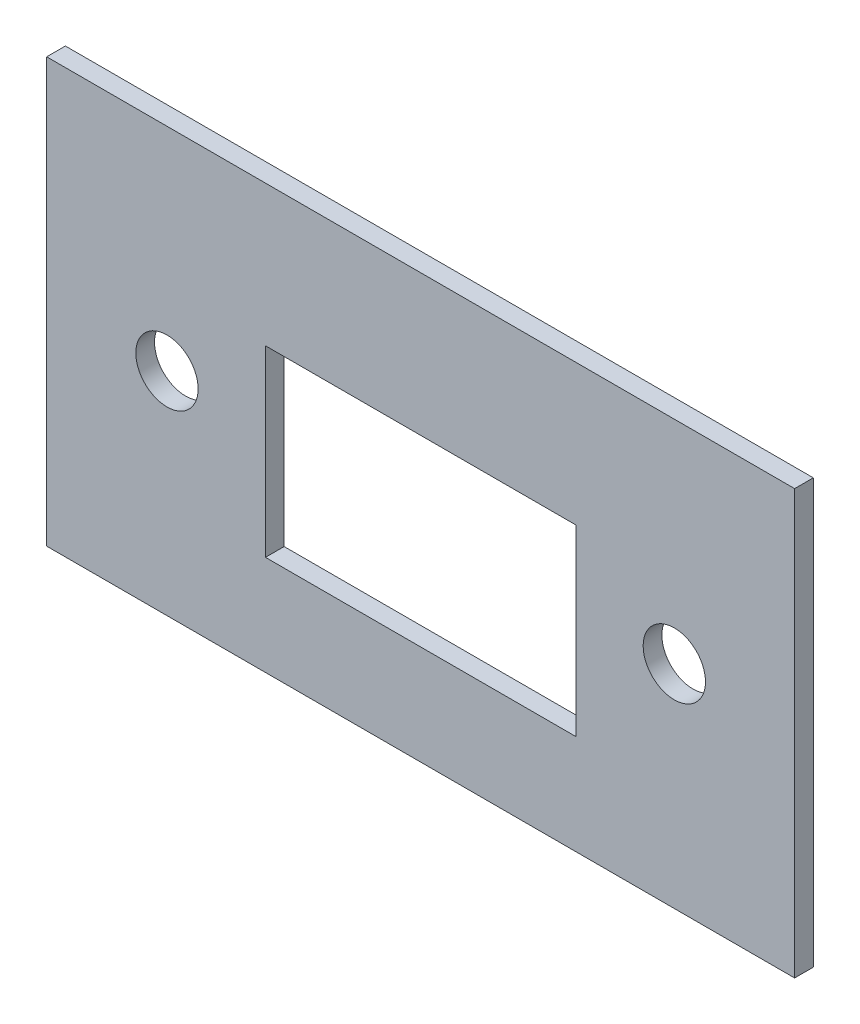
ISO-10303-21;
HEADER;
FILE_DESCRIPTION(('STEP AP214'),'2;1');
FILE_NAME('part.step','',(''),(''),'','','');
FILE_SCHEMA(('AUTOMOTIVE_DESIGN { 1 0 10303 214 1 1 1 1 }'));
ENDSEC;
DATA;
#1=APPLICATION_CONTEXT('core data for automotive mechanical design processes');
#2=APPLICATION_PROTOCOL_DEFINITION('international standard','automotive_design',2000,#1);
#3=PRODUCT_CONTEXT('',#1,'mechanical');
#4=PRODUCT('Part','Part','',(#3));
#5=PRODUCT_RELATED_PRODUCT_CATEGORY('part','',(#4));
#6=PRODUCT_DEFINITION_FORMATION('','',#4);
#7=PRODUCT_DEFINITION_CONTEXT('part definition',#1,'design');
#8=PRODUCT_DEFINITION('design','',#6,#7);
#9=PRODUCT_DEFINITION_SHAPE('','',#8);
#10=(LENGTH_UNIT() NAMED_UNIT(*) SI_UNIT(.MILLI.,.METRE.));
#11=(NAMED_UNIT(*) PLANE_ANGLE_UNIT() SI_UNIT($,.RADIAN.));
#12=(NAMED_UNIT(*) SI_UNIT($,.STERADIAN.) SOLID_ANGLE_UNIT());
#13=UNCERTAINTY_MEASURE_WITH_UNIT(LENGTH_MEASURE(1.E-05),#10,'distance_accuracy_value','');
#14=(GEOMETRIC_REPRESENTATION_CONTEXT(3) GLOBAL_UNCERTAINTY_ASSIGNED_CONTEXT((#13)) GLOBAL_UNIT_ASSIGNED_CONTEXT((#10,
#11,#12)) REPRESENTATION_CONTEXT('',''));
#15=CARTESIAN_POINT('',(0.,0.,0.));
#16=DIRECTION('',(0.,0.,1.));
#17=DIRECTION('',(1.,0.,0.));
#18=AXIS2_PLACEMENT_3D('',#15,#16,#17);
#19=CARTESIAN_POINT('',(0.,0.,0.));
#20=DIRECTION('',(0.,0.,1.));
#21=DIRECTION('',(1.,0.,0.));
#22=AXIS2_PLACEMENT_3D('',#19,#20,#21);
#23=PLANE('',#22);
#24=CARTESIAN_POINT('',(-20.3499999999777,14.9,0.));
#25=DIRECTION('',(0.,0.,-1.));
#26=DIRECTION('',(-1.,0.,0.));
#27=AXIS2_PLACEMENT_3D('',#24,#25,#26);
#28=CIRCLE('',#27,2.5);
#29=CARTESIAN_POINT('',(-22.8499999999777,14.9,0.));
#30=VERTEX_POINT('',#29);
#31=EDGE_CURVE('E370',#30,#30,#28,.T.);
#32=ORIENTED_EDGE('',*,*,#31,.F.);
#33=EDGE_LOOP('',(#32));
#34=FACE_BOUND('',#33,.T.);
#35=CARTESIAN_POINT('',(20.3500000000222,14.8999999999999,0.));
#36=DIRECTION('',(0.,0.,-1.));
#37=DIRECTION('',(-1.,0.,0.));
#38=AXIS2_PLACEMENT_3D('',#35,#36,#37);
#39=CIRCLE('',#38,2.5);
#40=CARTESIAN_POINT('',(17.8500000000222,14.8999999999999,0.));
#41=VERTEX_POINT('',#40);
#42=EDGE_CURVE('E374',#41,#41,#39,.T.);
#43=ORIENTED_EDGE('',*,*,#42,.F.);
#44=EDGE_LOOP('',(#43));
#45=FACE_BOUND('',#44,.T.);
#46=DIRECTION('',(0.,1.,0.));
#47=VECTOR('',#46,1.);
#48=CARTESIAN_POINT('',(26.4,1.5,0.));
#49=LINE('',#48,#47);
#50=CARTESIAN_POINT('',(26.4,1.5,0.));
#51=VERTEX_POINT('',#50);
#52=CARTESIAN_POINT('',(26.4,28.3,0.));
#53=VERTEX_POINT('',#52);
#54=EDGE_CURVE('E213',#51,#53,#49,.T.);
#55=ORIENTED_EDGE('',*,*,#54,.F.);
#56=DIRECTION('',(1.,0.,0.));
#57=VECTOR('',#56,1.);
#58=CARTESIAN_POINT('',(-26.4,1.5,0.));
#59=LINE('',#58,#57);
#60=CARTESIAN_POINT('',(-26.4,1.5,0.));
#61=VERTEX_POINT('',#60);
#62=EDGE_CURVE('E218',#61,#51,#59,.T.);
#63=ORIENTED_EDGE('',*,*,#62,.F.);
#64=DIRECTION('',(0.,-1.,0.));
#65=VECTOR('',#64,1.);
#66=CARTESIAN_POINT('',(-26.4,28.3,0.));
#67=LINE('',#66,#65);
#68=CARTESIAN_POINT('',(-26.4,28.3,0.));
#69=VERTEX_POINT('',#68);
#70=EDGE_CURVE('E233',#69,#61,#67,.T.);
#71=ORIENTED_EDGE('',*,*,#70,.F.);
#72=DIRECTION('',(-1.,0.,0.));
#73=VECTOR('',#72,1.);
#74=CARTESIAN_POINT('',(26.4,28.3,0.));
#75=LINE('',#74,#73);
#76=EDGE_CURVE('E230',#53,#69,#75,.T.);
#77=ORIENTED_EDGE('',*,*,#76,.F.);
#78=EDGE_LOOP('',(#55,#63,#71,#77));
#79=FACE_BOUND('',#78,.T.);
#80=DIRECTION('',(0.,-1.,0.));
#81=VECTOR('',#80,1.);
#82=CARTESIAN_POINT('',(12.45,5.9,0.));
#83=LINE('',#82,#81);
#84=CARTESIAN_POINT('',(12.45,20.5999999999998,0.));
#85=VERTEX_POINT('',#84);
#86=CARTESIAN_POINT('',(12.45,5.9,0.));
#87=VERTEX_POINT('',#86);
#88=EDGE_CURVE('E183',#85,#87,#83,.T.);
#89=ORIENTED_EDGE('',*,*,#88,.F.);
#90=DIRECTION('',(1.,0.,0.));
#91=VECTOR('',#90,1.);
#92=CARTESIAN_POINT('',(12.45,20.5999999999998,0.));
#93=LINE('',#92,#91);
#94=CARTESIAN_POINT('',(-12.45,20.5999999999998,0.));
#95=VERTEX_POINT('',#94);
#96=EDGE_CURVE('E180',#95,#85,#93,.T.);
#97=ORIENTED_EDGE('',*,*,#96,.F.);
#98=DIRECTION('',(0.,1.,0.));
#99=VECTOR('',#98,1.);
#100=CARTESIAN_POINT('',(-12.45,20.5999999999998,0.));
#101=LINE('',#100,#99);
#102=CARTESIAN_POINT('',(-12.45,5.9,0.));
#103=VERTEX_POINT('',#102);
#104=EDGE_CURVE('E158',#103,#95,#101,.T.);
#105=ORIENTED_EDGE('',*,*,#104,.F.);
#106=DIRECTION('',(-1.,0.,0.));
#107=VECTOR('',#106,1.);
#108=CARTESIAN_POINT('',(-12.45,5.9,0.));
#109=LINE('',#108,#107);
#110=EDGE_CURVE('E383',#87,#103,#109,.T.);
#111=ORIENTED_EDGE('',*,*,#110,.F.);
#112=EDGE_LOOP('',(#89,#97,#105,#111));
#113=FACE_BOUND('',#112,.T.);
#114=ADVANCED_FACE('F37',(#34,#45,#79,#113),#23,.F.);
#115=CARTESIAN_POINT('',(27.9,29.8,-2.));
#116=DIRECTION('',(0.,1.,0.));
#117=DIRECTION('',(0.,0.,1.));
#118=AXIS2_PLACEMENT_3D('',#115,#116,#117);
#119=PLANE('',#118);
#120=DIRECTION('',(-1.,0.,0.));
#121=VECTOR('',#120,1.);
#122=CARTESIAN_POINT('',(27.9,29.8,0.));
#123=LINE('',#122,#121);
#124=CARTESIAN_POINT('',(27.9,29.8,0.));
#125=VERTEX_POINT('',#124);
#126=CARTESIAN_POINT('',(-27.9,29.8,0.));
#127=VERTEX_POINT('',#126);
#128=EDGE_CURVE('E241',#125,#127,#123,.T.);
#129=ORIENTED_EDGE('',*,*,#128,.F.);
#130=DIRECTION('',(0.,0.,1.));
#131=VECTOR('',#130,1.);
#132=CARTESIAN_POINT('',(27.9,29.8,-2.));
#133=LINE('',#132,#131);
#134=CARTESIAN_POINT('',(27.9,29.8,-2.));
#135=VERTEX_POINT('',#134);
#136=EDGE_CURVE('E11',#135,#125,#133,.T.);
#137=ORIENTED_EDGE('',*,*,#136,.F.);
#138=DIRECTION('',(-1.,0.,0.));
#139=VECTOR('',#138,1.);
#140=CARTESIAN_POINT('',(27.9,29.8,-2.));
#141=LINE('',#140,#139);
#142=CARTESIAN_POINT('',(-27.9,29.8,-2.));
#143=VERTEX_POINT('',#142);
#144=EDGE_CURVE('E250',#135,#143,#141,.T.);
#145=ORIENTED_EDGE('',*,*,#144,.T.);
#146=DIRECTION('',(0.,0.,1.));
#147=VECTOR('',#146,1.);
#148=CARTESIAN_POINT('',(-27.9,29.8,-2.));
#149=LINE('',#148,#147);
#150=EDGE_CURVE('E41',#143,#127,#149,.T.);
#151=ORIENTED_EDGE('',*,*,#150,.T.);
#152=EDGE_LOOP('',(#129,#137,#145,#151));
#153=FACE_BOUND('',#152,.T.);
#154=ADVANCED_FACE('F39',(#153),#119,.T.);
#155=CARTESIAN_POINT('',(27.9000000000001,0.,-2.));
#156=DIRECTION('',(1.,0.,0.));
#157=DIRECTION('',(0.,1.,0.));
#158=AXIS2_PLACEMENT_3D('',#155,#156,#157);
#159=PLANE('',#158);
#160=DIRECTION('',(0.,1.,0.));
#161=VECTOR('',#160,1.);
#162=CARTESIAN_POINT('',(27.9000000000001,0.,0.));
#163=LINE('',#162,#161);
#164=CARTESIAN_POINT('',(27.9000000000001,0.,0.));
#165=VERTEX_POINT('',#164);
#166=EDGE_CURVE('E254',#165,#125,#163,.T.);
#167=ORIENTED_EDGE('',*,*,#166,.F.);
#168=DIRECTION('',(0.,0.,1.));
#169=VECTOR('',#168,1.);
#170=CARTESIAN_POINT('',(27.9000000000001,0.,-2.));
#171=LINE('',#170,#169);
#172=CARTESIAN_POINT('',(27.9000000000001,0.,-2.));
#173=VERTEX_POINT('',#172);
#174=EDGE_CURVE('E46',#173,#165,#171,.T.);
#175=ORIENTED_EDGE('',*,*,#174,.F.);
#176=DIRECTION('',(0.,1.,0.));
#177=VECTOR('',#176,1.);
#178=CARTESIAN_POINT('',(27.9000000000001,0.,-2.));
#179=LINE('',#178,#177);
#180=EDGE_CURVE('E260',#173,#135,#179,.T.);
#181=ORIENTED_EDGE('',*,*,#180,.T.);
#182=ORIENTED_EDGE('',*,*,#136,.T.);
#183=EDGE_LOOP('',(#167,#175,#181,#182));
#184=FACE_BOUND('',#183,.T.);
#185=ADVANCED_FACE('F285',(#184),#159,.T.);
#186=CARTESIAN_POINT('',(-27.9,0.,-2.));
#187=DIRECTION('',(0.,-1.,0.));
#188=DIRECTION('',(0.,0.,-1.));
#189=AXIS2_PLACEMENT_3D('',#186,#187,#188);
#190=PLANE('',#189);
#191=DIRECTION('',(1.,0.,0.));
#192=VECTOR('',#191,1.);
#193=CARTESIAN_POINT('',(-27.9,0.,0.));
#194=LINE('',#193,#192);
#195=CARTESIAN_POINT('',(-27.9,0.,0.));
#196=VERTEX_POINT('',#195);
#197=EDGE_CURVE('E268',#196,#165,#194,.T.);
#198=ORIENTED_EDGE('',*,*,#197,.F.);
#199=DIRECTION('',(0.,0.,1.));
#200=VECTOR('',#199,1.);
#201=CARTESIAN_POINT('',(-27.9,0.,-2.));
#202=LINE('',#201,#200);
#203=CARTESIAN_POINT('',(-27.9,0.,-2.));
#204=VERTEX_POINT('',#203);
#205=EDGE_CURVE('E273',#204,#196,#202,.T.);
#206=ORIENTED_EDGE('',*,*,#205,.F.);
#207=DIRECTION('',(1.,0.,0.));
#208=VECTOR('',#207,1.);
#209=CARTESIAN_POINT('',(-27.9,0.,-2.));
#210=LINE('',#209,#208);
#211=EDGE_CURVE('E257',#204,#173,#210,.T.);
#212=ORIENTED_EDGE('',*,*,#211,.T.);
#213=ORIENTED_EDGE('',*,*,#174,.T.);
#214=EDGE_LOOP('',(#198,#206,#212,#213));
#215=FACE_BOUND('',#214,.T.);
#216=ADVANCED_FACE('F291',(#215),#190,.T.);
#217=CARTESIAN_POINT('',(-27.9,29.8,-2.));
#218=DIRECTION('',(-1.,0.,0.));
#219=DIRECTION('',(0.,0.,1.));
#220=AXIS2_PLACEMENT_3D('',#217,#218,#219);
#221=PLANE('',#220);
#222=DIRECTION('',(0.,-1.,0.));
#223=VECTOR('',#222,1.);
#224=CARTESIAN_POINT('',(-27.9,29.8,0.));
#225=LINE('',#224,#223);
#226=EDGE_CURVE('E265',#127,#196,#225,.T.);
#227=ORIENTED_EDGE('',*,*,#226,.F.);
#228=ORIENTED_EDGE('',*,*,#150,.F.);
#229=DIRECTION('',(0.,-1.,0.));
#230=VECTOR('',#229,1.);
#231=CARTESIAN_POINT('',(-27.9,29.8,-2.));
#232=LINE('',#231,#230);
#233=EDGE_CURVE('E253',#143,#204,#232,.T.);
#234=ORIENTED_EDGE('',*,*,#233,.T.);
#235=ORIENTED_EDGE('',*,*,#205,.T.);
#236=EDGE_LOOP('',(#227,#228,#234,#235));
#237=FACE_BOUND('',#236,.T.);
#238=ADVANCED_FACE('F280',(#237),#221,.T.);
#239=CARTESIAN_POINT('',(0.,0.,-2.));
#240=DIRECTION('',(0.,0.,1.));
#241=DIRECTION('',(1.,0.,0.));
#242=AXIS2_PLACEMENT_3D('',#239,#240,#241);
#243=PLANE('',#242);
#244=DIRECTION('',(1.,0.,0.));
#245=VECTOR('',#244,1.);
#246=CARTESIAN_POINT('',(-26.4,1.5,-2.));
#247=LINE('',#246,#245);
#248=CARTESIAN_POINT('',(-26.4,1.5,-2.));
#249=VERTEX_POINT('',#248);
#250=CARTESIAN_POINT('',(26.4,1.5,-2.));
#251=VERTEX_POINT('',#250);
#252=EDGE_CURVE('E224',#249,#251,#247,.T.);
#253=ORIENTED_EDGE('',*,*,#252,.T.);
#254=DIRECTION('',(0.,1.,0.));
#255=VECTOR('',#254,1.);
#256=CARTESIAN_POINT('',(26.4,1.5,-2.));
#257=LINE('',#256,#255);
#258=CARTESIAN_POINT('',(26.4,28.3,-2.));
#259=VERTEX_POINT('',#258);
#260=EDGE_CURVE('E214',#251,#259,#257,.T.);
#261=ORIENTED_EDGE('',*,*,#260,.T.);
#262=DIRECTION('',(-1.,0.,0.));
#263=VECTOR('',#262,1.);
#264=CARTESIAN_POINT('',(26.4,28.3,-2.));
#265=LINE('',#264,#263);
#266=CARTESIAN_POINT('',(-26.4,28.3,-2.));
#267=VERTEX_POINT('',#266);
#268=EDGE_CURVE('E217',#259,#267,#265,.T.);
#269=ORIENTED_EDGE('',*,*,#268,.T.);
#270=DIRECTION('',(0.,-1.,0.));
#271=VECTOR('',#270,1.);
#272=CARTESIAN_POINT('',(-26.4,28.3,-2.));
#273=LINE('',#272,#271);
#274=EDGE_CURVE('E221',#267,#249,#273,.T.);
#275=ORIENTED_EDGE('',*,*,#274,.T.);
#276=EDGE_LOOP('',(#253,#261,#269,#275));
#277=FACE_BOUND('',#276,.T.);
#278=ORIENTED_EDGE('',*,*,#144,.F.);
#279=ORIENTED_EDGE('',*,*,#180,.F.);
#280=ORIENTED_EDGE('',*,*,#211,.F.);
#281=ORIENTED_EDGE('',*,*,#233,.F.);
#282=EDGE_LOOP('',(#278,#279,#280,#281));
#283=FACE_BOUND('',#282,.T.);
#284=ADVANCED_FACE('F288',(#277,#283),#243,.F.);
#285=CARTESIAN_POINT('',(26.4,1.5,-2.));
#286=DIRECTION('',(1.,0.,0.));
#287=DIRECTION('',(0.,0.,-1.));
#288=AXIS2_PLACEMENT_3D('',#285,#286,#287);
#289=PLANE('',#288);
#290=ORIENTED_EDGE('',*,*,#54,.T.);
#291=DIRECTION('',(0.,0.,1.));
#292=VECTOR('',#291,1.);
#293=CARTESIAN_POINT('',(26.4,28.3,-2.));
#294=LINE('',#293,#292);
#295=EDGE_CURVE('E227',#259,#53,#294,.T.);
#296=ORIENTED_EDGE('',*,*,#295,.F.);
#297=ORIENTED_EDGE('',*,*,#260,.F.);
#298=DIRECTION('',(0.,0.,1.));
#299=VECTOR('',#298,1.);
#300=CARTESIAN_POINT('',(26.4,1.5,-2.));
#301=LINE('',#300,#299);
#302=EDGE_CURVE('E238',#251,#51,#301,.T.);
#303=ORIENTED_EDGE('',*,*,#302,.T.);
#304=EDGE_LOOP('',(#290,#296,#297,#303));
#305=FACE_BOUND('',#304,.T.);
#306=ADVANCED_FACE('F394',(#305),#289,.F.);
#307=CARTESIAN_POINT('',(-26.4,1.5,-2.));
#308=DIRECTION('',(0.,-1.,0.));
#309=DIRECTION('',(0.,0.,-1.));
#310=AXIS2_PLACEMENT_3D('',#307,#308,#309);
#311=PLANE('',#310);
#312=ORIENTED_EDGE('',*,*,#62,.T.);
#313=ORIENTED_EDGE('',*,*,#302,.F.);
#314=ORIENTED_EDGE('',*,*,#252,.F.);
#315=DIRECTION('',(0.,0.,1.));
#316=VECTOR('',#315,1.);
#317=CARTESIAN_POINT('',(-26.4,1.5,-2.));
#318=LINE('',#317,#316);
#319=EDGE_CURVE('E242',#249,#61,#318,.T.);
#320=ORIENTED_EDGE('',*,*,#319,.T.);
#321=EDGE_LOOP('',(#312,#313,#314,#320));
#322=FACE_BOUND('',#321,.T.);
#323=ADVANCED_FACE('F397',(#322),#311,.F.);
#324=CARTESIAN_POINT('',(-26.4,28.3,-2.));
#325=DIRECTION('',(-1.,0.,0.));
#326=DIRECTION('',(0.,0.,1.));
#327=AXIS2_PLACEMENT_3D('',#324,#325,#326);
#328=PLANE('',#327);
#329=ORIENTED_EDGE('',*,*,#70,.T.);
#330=ORIENTED_EDGE('',*,*,#319,.F.);
#331=ORIENTED_EDGE('',*,*,#274,.F.);
#332=DIRECTION('',(0.,0.,1.));
#333=VECTOR('',#332,1.);
#334=CARTESIAN_POINT('',(-26.4,28.3,-2.));
#335=LINE('',#334,#333);
#336=EDGE_CURVE('E245',#267,#69,#335,.T.);
#337=ORIENTED_EDGE('',*,*,#336,.T.);
#338=EDGE_LOOP('',(#329,#330,#331,#337));
#339=FACE_BOUND('',#338,.T.);
#340=ADVANCED_FACE('F346',(#339),#328,.F.);
#341=CARTESIAN_POINT('',(26.4,28.3,-2.));
#342=DIRECTION('',(0.,1.,0.));
#343=DIRECTION('',(-1.,0.,0.));
#344=AXIS2_PLACEMENT_3D('',#341,#342,#343);
#345=PLANE('',#344);
#346=ORIENTED_EDGE('',*,*,#76,.T.);
#347=ORIENTED_EDGE('',*,*,#336,.F.);
#348=ORIENTED_EDGE('',*,*,#268,.F.);
#349=ORIENTED_EDGE('',*,*,#295,.T.);
#350=EDGE_LOOP('',(#346,#347,#348,#349));
#351=FACE_BOUND('',#350,.T.);
#352=ADVANCED_FACE('F339',(#351),#345,.F.);
#353=CARTESIAN_POINT('',(0.,0.,1.5));
#354=DIRECTION('',(0.,0.,1.));
#355=DIRECTION('',(1.,0.,0.));
#356=AXIS2_PLACEMENT_3D('',#353,#354,#355);
#357=PLANE('',#356);
#358=CARTESIAN_POINT('',(-20.3499999999777,14.9,1.5));
#359=DIRECTION('',(0.,0.,1.));
#360=DIRECTION('',(1.,0.,0.));
#361=AXIS2_PLACEMENT_3D('',#358,#359,#360);
#362=CIRCLE('',#361,2.5);
#363=CARTESIAN_POINT('',(-17.8499999999777,14.9,1.5));
#364=VERTEX_POINT('',#363);
#365=EDGE_CURVE('E372',#364,#364,#362,.F.);
#366=ORIENTED_EDGE('',*,*,#365,.T.);
#367=EDGE_LOOP('',(#366));
#368=FACE_BOUND('',#367,.T.);
#369=CARTESIAN_POINT('',(20.3500000000222,14.8999999999999,1.5));
#370=DIRECTION('',(0.,0.,1.));
#371=DIRECTION('',(1.,0.,0.));
#372=AXIS2_PLACEMENT_3D('',#369,#370,#371);
#373=CIRCLE('',#372,2.5);
#374=CARTESIAN_POINT('',(22.8500000000222,14.8999999999999,1.5));
#375=VERTEX_POINT('',#374);
#376=EDGE_CURVE('E377',#375,#375,#373,.F.);
#377=ORIENTED_EDGE('',*,*,#376,.T.);
#378=EDGE_LOOP('',(#377));
#379=FACE_BOUND('',#378,.T.);
#380=DIRECTION('',(0.,1.,0.));
#381=VECTOR('',#380,1.);
#382=CARTESIAN_POINT('',(12.45,5.9,1.5));
#383=LINE('',#382,#381);
#384=CARTESIAN_POINT('',(12.45,5.9,1.5));
#385=VERTEX_POINT('',#384);
#386=CARTESIAN_POINT('',(12.45,20.5999999999998,1.5));
#387=VERTEX_POINT('',#386);
#388=EDGE_CURVE('E62',#385,#387,#383,.T.);
#389=ORIENTED_EDGE('',*,*,#388,.F.);
#390=DIRECTION('',(1.,0.,0.));
#391=VECTOR('',#390,1.);
#392=CARTESIAN_POINT('',(-12.45,5.9,1.5));
#393=LINE('',#392,#391);
#394=CARTESIAN_POINT('',(-12.45,5.9,1.5));
#395=VERTEX_POINT('',#394);
#396=EDGE_CURVE('E171',#395,#385,#393,.T.);
#397=ORIENTED_EDGE('',*,*,#396,.F.);
#398=DIRECTION('',(0.,-1.,0.));
#399=VECTOR('',#398,1.);
#400=CARTESIAN_POINT('',(-12.45,20.5999999999998,1.5));
#401=LINE('',#400,#399);
#402=CARTESIAN_POINT('',(-12.45,20.5999999999998,1.5));
#403=VERTEX_POINT('',#402);
#404=EDGE_CURVE('E155',#403,#395,#401,.T.);
#405=ORIENTED_EDGE('',*,*,#404,.F.);
#406=DIRECTION('',(-1.,0.,0.));
#407=VECTOR('',#406,1.);
#408=CARTESIAN_POINT('',(12.45,20.5999999999998,1.5));
#409=LINE('',#408,#407);
#410=EDGE_CURVE('E164',#387,#403,#409,.T.);
#411=ORIENTED_EDGE('',*,*,#410,.F.);
#412=EDGE_LOOP('',(#389,#397,#405,#411));
#413=FACE_BOUND('',#412,.T.);
#414=DIRECTION('',(1.,0.,0.));
#415=VECTOR('',#414,1.);
#416=CARTESIAN_POINT('',(-30.,-2.10000000000001,1.5));
#417=LINE('',#416,#415);
#418=CARTESIAN_POINT('',(-30.,-2.10000000000001,1.5));
#419=VERTEX_POINT('',#418);
#420=CARTESIAN_POINT('',(30.,-2.10000000000001,1.5));
#421=VERTEX_POINT('',#420);
#422=EDGE_CURVE('E184',#419,#421,#417,.T.);
#423=ORIENTED_EDGE('',*,*,#422,.T.);
#424=DIRECTION('',(0.,1.,0.));
#425=VECTOR('',#424,1.);
#426=CARTESIAN_POINT('',(30.,-2.10000000000001,1.5));
#427=LINE('',#426,#425);
#428=CARTESIAN_POINT('',(30.,31.9,1.5));
#429=VERTEX_POINT('',#428);
#430=EDGE_CURVE('E187',#421,#429,#427,.T.);
#431=ORIENTED_EDGE('',*,*,#430,.T.);
#432=DIRECTION('',(-1.,0.,0.));
#433=VECTOR('',#432,1.);
#434=CARTESIAN_POINT('',(30.,31.9,1.5));
#435=LINE('',#434,#433);
#436=CARTESIAN_POINT('',(-30.,31.9,1.5));
#437=VERTEX_POINT('',#436);
#438=EDGE_CURVE('E190',#429,#437,#435,.T.);
#439=ORIENTED_EDGE('',*,*,#438,.T.);
#440=DIRECTION('',(0.,-1.,0.));
#441=VECTOR('',#440,1.);
#442=CARTESIAN_POINT('',(-30.,31.9,1.5));
#443=LINE('',#442,#441);
#444=EDGE_CURVE('E192',#437,#419,#443,.T.);
#445=ORIENTED_EDGE('',*,*,#444,.T.);
#446=EDGE_LOOP('',(#423,#431,#439,#445));
#447=FACE_BOUND('',#446,.T.);
#448=ADVANCED_FACE('F168',(#368,#379,#413,#447),#357,.T.);
#449=CARTESIAN_POINT('',(-30.,31.9,1.5));
#450=DIRECTION('',(1.,0.,0.));
#451=DIRECTION('',(0.,0.,-1.));
#452=AXIS2_PLACEMENT_3D('',#449,#450,#451);
#453=PLANE('',#452);
#454=DIRECTION('',(0.,-1.,0.));
#455=VECTOR('',#454,1.);
#456=CARTESIAN_POINT('',(-30.,31.9,0.));
#457=LINE('',#456,#455);
#458=CARTESIAN_POINT('',(-30.,31.9,0.));
#459=VERTEX_POINT('',#458);
#460=CARTESIAN_POINT('',(-30.,-2.10000000000001,0.));
#461=VERTEX_POINT('',#460);
#462=EDGE_CURVE('E188',#459,#461,#457,.T.);
#463=ORIENTED_EDGE('',*,*,#462,.T.);
#464=DIRECTION('',(0.,0.,-1.));
#465=VECTOR('',#464,1.);
#466=CARTESIAN_POINT('',(-30.,-2.10000000000001,1.5));
#467=LINE('',#466,#465);
#468=EDGE_CURVE('E194',#419,#461,#467,.T.);
#469=ORIENTED_EDGE('',*,*,#468,.F.);
#470=ORIENTED_EDGE('',*,*,#444,.F.);
#471=DIRECTION('',(0.,0.,-1.));
#472=VECTOR('',#471,1.);
#473=CARTESIAN_POINT('',(-30.,31.9,1.5));
#474=LINE('',#473,#472);
#475=EDGE_CURVE('E204',#437,#459,#474,.T.);
#476=ORIENTED_EDGE('',*,*,#475,.T.);
#477=EDGE_LOOP('',(#463,#469,#470,#476));
#478=FACE_BOUND('',#477,.T.);
#479=ADVANCED_FACE('F332',(#478),#453,.F.);
#480=CARTESIAN_POINT('',(30.,31.9,1.5));
#481=DIRECTION('',(0.,-1.,0.));
#482=DIRECTION('',(0.,0.,-1.));
#483=AXIS2_PLACEMENT_3D('',#480,#481,#482);
#484=PLANE('',#483);
#485=DIRECTION('',(-1.,0.,0.));
#486=VECTOR('',#485,1.);
#487=CARTESIAN_POINT('',(30.,31.9,0.));
#488=LINE('',#487,#486);
#489=CARTESIAN_POINT('',(30.,31.9,0.));
#490=VERTEX_POINT('',#489);
#491=EDGE_CURVE('E199',#490,#459,#488,.T.);
#492=ORIENTED_EDGE('',*,*,#491,.T.);
#493=ORIENTED_EDGE('',*,*,#475,.F.);
#494=ORIENTED_EDGE('',*,*,#438,.F.);
#495=DIRECTION('',(0.,0.,-1.));
#496=VECTOR('',#495,1.);
#497=CARTESIAN_POINT('',(30.,31.9,1.5));
#498=LINE('',#497,#496);
#499=EDGE_CURVE('E207',#429,#490,#498,.T.);
#500=ORIENTED_EDGE('',*,*,#499,.T.);
#501=EDGE_LOOP('',(#492,#493,#494,#500));
#502=FACE_BOUND('',#501,.T.);
#503=ADVANCED_FACE('F336',(#502),#484,.F.);
#504=CARTESIAN_POINT('',(30.,-2.10000000000001,1.5));
#505=DIRECTION('',(-1.,0.,0.));
#506=DIRECTION('',(0.,0.,1.));
#507=AXIS2_PLACEMENT_3D('',#504,#505,#506);
#508=PLANE('',#507);
#509=DIRECTION('',(0.,1.,0.));
#510=VECTOR('',#509,1.);
#511=CARTESIAN_POINT('',(30.,-2.10000000000001,0.));
#512=LINE('',#511,#510);
#513=CARTESIAN_POINT('',(30.,-2.10000000000001,0.));
#514=VERTEX_POINT('',#513);
#515=EDGE_CURVE('E197',#514,#490,#512,.T.);
#516=ORIENTED_EDGE('',*,*,#515,.T.);
#517=ORIENTED_EDGE('',*,*,#499,.F.);
#518=ORIENTED_EDGE('',*,*,#430,.F.);
#519=DIRECTION('',(0.,0.,-1.));
#520=VECTOR('',#519,1.);
#521=CARTESIAN_POINT('',(30.,-2.10000000000001,1.5));
#522=LINE('',#521,#520);
#523=EDGE_CURVE('E210',#421,#514,#522,.T.);
#524=ORIENTED_EDGE('',*,*,#523,.T.);
#525=EDGE_LOOP('',(#516,#517,#518,#524));
#526=FACE_BOUND('',#525,.T.);
#527=ADVANCED_FACE('F321',(#526),#508,.F.);
#528=CARTESIAN_POINT('',(-30.,-2.10000000000001,1.5));
#529=DIRECTION('',(0.,1.,0.));
#530=DIRECTION('',(0.,0.,1.));
#531=AXIS2_PLACEMENT_3D('',#528,#529,#530);
#532=PLANE('',#531);
#533=DIRECTION('',(1.,0.,0.));
#534=VECTOR('',#533,1.);
#535=CARTESIAN_POINT('',(-30.,-2.10000000000001,0.));
#536=LINE('',#535,#534);
#537=EDGE_CURVE('E182',#461,#514,#536,.T.);
#538=ORIENTED_EDGE('',*,*,#537,.T.);
#539=ORIENTED_EDGE('',*,*,#523,.F.);
#540=ORIENTED_EDGE('',*,*,#422,.F.);
#541=ORIENTED_EDGE('',*,*,#468,.T.);
#542=EDGE_LOOP('',(#538,#539,#540,#541));
#543=FACE_BOUND('',#542,.T.);
#544=ADVANCED_FACE('F313',(#543),#532,.F.);
#545=ORIENTED_EDGE('',*,*,#537,.F.);
#546=ORIENTED_EDGE('',*,*,#462,.F.);
#547=ORIENTED_EDGE('',*,*,#491,.F.);
#548=ORIENTED_EDGE('',*,*,#515,.F.);
#549=EDGE_LOOP('',(#545,#546,#547,#548));
#550=FACE_BOUND('',#549,.T.);
#551=ORIENTED_EDGE('',*,*,#166,.T.);
#552=ORIENTED_EDGE('',*,*,#128,.T.);
#553=ORIENTED_EDGE('',*,*,#226,.T.);
#554=ORIENTED_EDGE('',*,*,#197,.T.);
#555=EDGE_LOOP('',(#551,#552,#553,#554));
#556=FACE_BOUND('',#555,.T.);
#557=ADVANCED_FACE('F282',(#550,#556),#23,.F.);
#558=CARTESIAN_POINT('',(12.45,5.9,-28.9153938240514));
#559=DIRECTION('',(1.,0.,0.));
#560=DIRECTION('',(0.,1.,0.));
#561=AXIS2_PLACEMENT_3D('',#558,#559,#560);
#562=PLANE('',#561);
#563=ORIENTED_EDGE('',*,*,#88,.T.);
#564=DIRECTION('',(0.,0.,1.));
#565=VECTOR('',#564,1.);
#566=CARTESIAN_POINT('',(12.45,5.9,-28.9153938240514));
#567=LINE('',#566,#565);
#568=EDGE_CURVE('E176',#87,#385,#567,.T.);
#569=ORIENTED_EDGE('',*,*,#568,.T.);
#570=ORIENTED_EDGE('',*,*,#388,.T.);
#571=DIRECTION('',(0.,0.,1.));
#572=VECTOR('',#571,1.);
#573=CARTESIAN_POINT('',(12.45,20.5999999999998,-28.9153938240514));
#574=LINE('',#573,#572);
#575=EDGE_CURVE('E161',#85,#387,#574,.T.);
#576=ORIENTED_EDGE('',*,*,#575,.F.);
#577=EDGE_LOOP('',(#563,#569,#570,#576));
#578=FACE_BOUND('',#577,.T.);
#579=ADVANCED_FACE('F312',(#578),#562,.F.);
#580=CARTESIAN_POINT('',(-12.45,5.9,-28.9153938240514));
#581=DIRECTION('',(0.,-1.,0.));
#582=DIRECTION('',(1.,0.,0.));
#583=AXIS2_PLACEMENT_3D('',#580,#581,#582);
#584=PLANE('',#583);
#585=ORIENTED_EDGE('',*,*,#110,.T.);
#586=DIRECTION('',(0.,0.,1.));
#587=VECTOR('',#586,1.);
#588=CARTESIAN_POINT('',(-12.45,5.9,-28.9153938240514));
#589=LINE('',#588,#587);
#590=EDGE_CURVE('E160',#103,#395,#589,.T.);
#591=ORIENTED_EDGE('',*,*,#590,.T.);
#592=ORIENTED_EDGE('',*,*,#396,.T.);
#593=ORIENTED_EDGE('',*,*,#568,.F.);
#594=EDGE_LOOP('',(#585,#591,#592,#593));
#595=FACE_BOUND('',#594,.T.);
#596=ADVANCED_FACE('F319',(#595),#584,.F.);
#597=CARTESIAN_POINT('',(-12.45,20.5999999999998,-28.9153938240514));
#598=DIRECTION('',(-1.,0.,0.));
#599=DIRECTION('',(0.,-1.,0.));
#600=AXIS2_PLACEMENT_3D('',#597,#598,#599);
#601=PLANE('',#600);
#602=ORIENTED_EDGE('',*,*,#104,.T.);
#603=DIRECTION('',(0.,0.,1.));
#604=VECTOR('',#603,1.);
#605=CARTESIAN_POINT('',(-12.45,20.5999999999998,-28.9153938240514));
#606=LINE('',#605,#604);
#607=EDGE_CURVE('E54',#95,#403,#606,.T.);
#608=ORIENTED_EDGE('',*,*,#607,.T.);
#609=ORIENTED_EDGE('',*,*,#404,.T.);
#610=ORIENTED_EDGE('',*,*,#590,.F.);
#611=EDGE_LOOP('',(#602,#608,#609,#610));
#612=FACE_BOUND('',#611,.T.);
#613=ADVANCED_FACE('F152',(#612),#601,.F.);
#614=CARTESIAN_POINT('',(12.45,20.5999999999998,-28.9153938240514));
#615=DIRECTION('',(0.,1.,0.));
#616=DIRECTION('',(-1.,0.,0.));
#617=AXIS2_PLACEMENT_3D('',#614,#615,#616);
#618=PLANE('',#617);
#619=ORIENTED_EDGE('',*,*,#96,.T.);
#620=ORIENTED_EDGE('',*,*,#575,.T.);
#621=ORIENTED_EDGE('',*,*,#410,.T.);
#622=ORIENTED_EDGE('',*,*,#607,.F.);
#623=EDGE_LOOP('',(#619,#620,#621,#622));
#624=FACE_BOUND('',#623,.T.);
#625=ADVANCED_FACE('F165',(#624),#618,.F.);
#626=CARTESIAN_POINT('',(20.3500000000222,14.8999999999999,8.57106781186547));
#627=DIRECTION('',(0.,0.,-1.));
#628=DIRECTION('',(-1.,0.,0.));
#629=AXIS2_PLACEMENT_3D('',#626,#627,#628);
#630=CYLINDRICAL_SURFACE('',#629,2.5);
#631=ORIENTED_EDGE('',*,*,#42,.T.);
#632=EDGE_LOOP('',(#631));
#633=FACE_BOUND('',#632,.T.);
#634=ORIENTED_EDGE('',*,*,#376,.F.);
#635=EDGE_LOOP('',(#634));
#636=FACE_BOUND('',#635,.T.);
#637=ADVANCED_FACE('F354',(#633,#636),#630,.F.);
#638=CARTESIAN_POINT('',(-20.3499999999777,14.9,8.57106781186547));
#639=DIRECTION('',(0.,0.,-1.));
#640=DIRECTION('',(-1.,0.,0.));
#641=AXIS2_PLACEMENT_3D('',#638,#639,#640);
#642=CYLINDRICAL_SURFACE('',#641,2.5);
#643=ORIENTED_EDGE('',*,*,#31,.T.);
#644=EDGE_LOOP('',(#643));
#645=FACE_BOUND('',#644,.T.);
#646=ORIENTED_EDGE('',*,*,#365,.F.);
#647=EDGE_LOOP('',(#646));
#648=FACE_BOUND('',#647,.T.);
#649=ADVANCED_FACE('F362',(#645,#648),#642,.F.);
#650=CLOSED_SHELL('',(#114,#154,#185,#216,#238,#284,#306,#323,#340,#352,#448,#479,#503,#527,
#544,#557,#579,#596,#613,#625,#637,#649));
#651=MANIFOLD_SOLID_BREP('B2',#650);
#652=ADVANCED_BREP_SHAPE_REPRESENTATION('',(#18,#651),#14);
#653=SHAPE_DEFINITION_REPRESENTATION(#9,#652);
ENDSEC;
END-ISO-10303-21;
